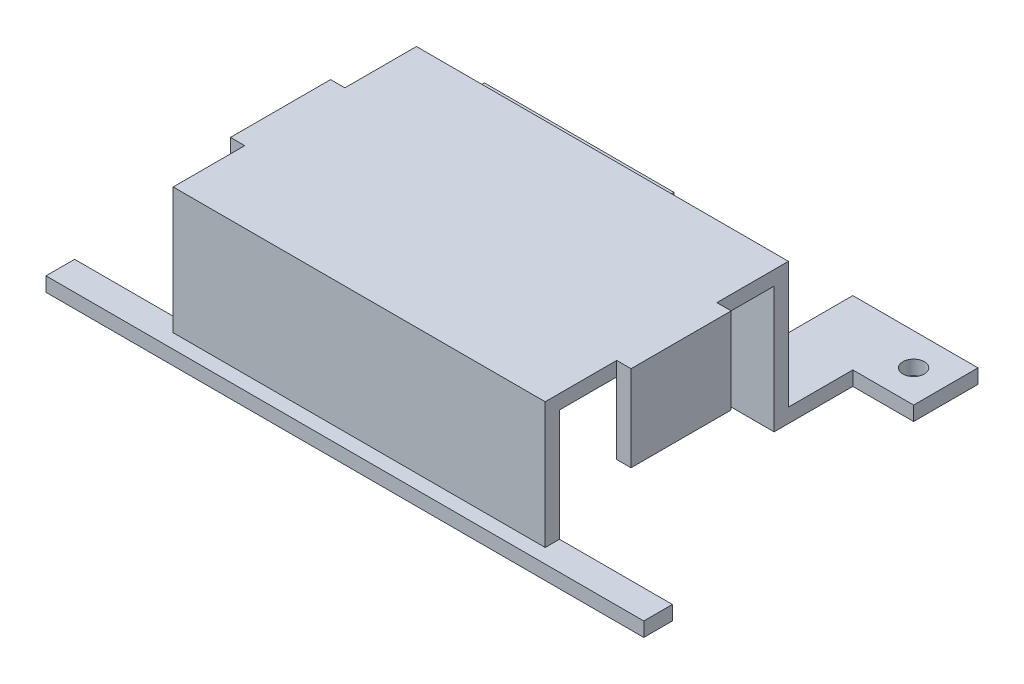
ISO-10303-21;
HEADER;
FILE_DESCRIPTION(('STEP AP214'),'2;1');
FILE_NAME('part.step','',(''),(''),'','','');
FILE_SCHEMA(('AUTOMOTIVE_DESIGN { 1 0 10303 214 1 1 1 1 }'));
ENDSEC;
DATA;
#1=APPLICATION_CONTEXT('core data for automotive mechanical design processes');
#2=APPLICATION_PROTOCOL_DEFINITION('international standard','automotive_design',2000,#1);
#3=PRODUCT_CONTEXT('',#1,'mechanical');
#4=PRODUCT('Part','Part','',(#3));
#5=PRODUCT_RELATED_PRODUCT_CATEGORY('part','',(#4));
#6=PRODUCT_DEFINITION_FORMATION('','',#4);
#7=PRODUCT_DEFINITION_CONTEXT('part definition',#1,'design');
#8=PRODUCT_DEFINITION('design','',#6,#7);
#9=PRODUCT_DEFINITION_SHAPE('','',#8);
#10=(LENGTH_UNIT() NAMED_UNIT(*) SI_UNIT(.MILLI.,.METRE.));
#11=(NAMED_UNIT(*) PLANE_ANGLE_UNIT() SI_UNIT($,.RADIAN.));
#12=(NAMED_UNIT(*) SI_UNIT($,.STERADIAN.) SOLID_ANGLE_UNIT());
#13=UNCERTAINTY_MEASURE_WITH_UNIT(LENGTH_MEASURE(1.E-05),#10,'distance_accuracy_value','');
#14=(GEOMETRIC_REPRESENTATION_CONTEXT(3) GLOBAL_UNCERTAINTY_ASSIGNED_CONTEXT((#13)) GLOBAL_UNIT_ASSIGNED_CONTEXT((#10,
#11,#12)) REPRESENTATION_CONTEXT('',''));
#15=CARTESIAN_POINT('',(0.,0.,0.));
#16=DIRECTION('',(0.,0.,1.));
#17=DIRECTION('',(1.,0.,0.));
#18=AXIS2_PLACEMENT_3D('',#15,#16,#17);
#19=CARTESIAN_POINT('',(0.,17.65,0.));
#20=DIRECTION('',(0.,1.,0.));
#21=DIRECTION('',(0.,0.,1.));
#22=AXIS2_PLACEMENT_3D('',#19,#20,#21);
#23=PLANE('',#22);
#24=DIRECTION('',(0.,0.,-1.));
#25=VECTOR('',#24,1.);
#26=CARTESIAN_POINT('',(52.,17.65,-24.));
#27=LINE('',#26,#25);
#28=CARTESIAN_POINT('',(52.,17.65,-10.));
#29=VERTEX_POINT('',#28);
#30=CARTESIAN_POINT('',(52.,17.65,-24.));
#31=VERTEX_POINT('',#30);
#32=EDGE_CURVE('E279',#29,#31,#27,.T.);
#33=ORIENTED_EDGE('',*,*,#32,.F.);
#34=DIRECTION('',(0.,0.,1.));
#35=VECTOR('',#34,1.);
#36=CARTESIAN_POINT('',(52.,17.65,-2.));
#37=LINE('',#36,#35);
#38=CARTESIAN_POINT('',(52.,17.65,-2.));
#39=VERTEX_POINT('',#38);
#40=EDGE_CURVE('E547',#29,#39,#37,.T.);
#41=ORIENTED_EDGE('',*,*,#40,.T.);
#42=DIRECTION('',(-1.,0.,0.));
#43=VECTOR('',#42,1.);
#44=CARTESIAN_POINT('',(52.,17.65,-2.));
#45=LINE('',#44,#43);
#46=CARTESIAN_POINT('',(0.,17.65,-2.));
#47=VERTEX_POINT('',#46);
#48=EDGE_CURVE('E546',#39,#47,#45,.T.);
#49=ORIENTED_EDGE('',*,*,#48,.T.);
#50=DIRECTION('',(0.,0.,-1.));
#51=VECTOR('',#50,1.);
#52=CARTESIAN_POINT('',(0.,17.65,-2.));
#53=LINE('',#52,#51);
#54=CARTESIAN_POINT('',(0.,17.65,-10.));
#55=VERTEX_POINT('',#54);
#56=EDGE_CURVE('E552',#47,#55,#53,.T.);
#57=ORIENTED_EDGE('',*,*,#56,.T.);
#58=DIRECTION('',(0.,0.,1.));
#59=VECTOR('',#58,1.);
#60=CARTESIAN_POINT('',(0.,17.65,-24.));
#61=LINE('',#60,#59);
#62=CARTESIAN_POINT('',(0.,17.65,-24.));
#63=VERTEX_POINT('',#62);
#64=EDGE_CURVE('E285',#63,#55,#61,.T.);
#65=ORIENTED_EDGE('',*,*,#64,.F.);
#66=CARTESIAN_POINT('',(0.,17.65,-34.));
#67=VERTEX_POINT('',#66);
#68=EDGE_CURVE('E551',#63,#67,#53,.T.);
#69=ORIENTED_EDGE('',*,*,#68,.T.);
#70=DIRECTION('',(-1.,0.,0.));
#71=VECTOR('',#70,1.);
#72=CARTESIAN_POINT('',(0.,17.65,-34.));
#73=LINE('',#72,#71);
#74=CARTESIAN_POINT('',(9.5,17.65,-34.));
#75=VERTEX_POINT('',#74);
#76=EDGE_CURVE('E398',#75,#67,#73,.T.);
#77=ORIENTED_EDGE('',*,*,#76,.F.);
#78=DIRECTION('',(0.,0.,-1.));
#79=VECTOR('',#78,1.);
#80=CARTESIAN_POINT('',(9.5,17.65,-43.));
#81=LINE('',#80,#79);
#82=CARTESIAN_POINT('',(9.5,17.65,-32.));
#83=VERTEX_POINT('',#82);
#84=EDGE_CURVE('E385',#83,#75,#81,.T.);
#85=ORIENTED_EDGE('',*,*,#84,.F.);
#86=DIRECTION('',(1.,0.,0.));
#87=VECTOR('',#86,1.);
#88=CARTESIAN_POINT('',(52.,17.65,-32.));
#89=LINE('',#88,#87);
#90=CARTESIAN_POINT('',(52.,17.65,-32.));
#91=VERTEX_POINT('',#90);
#92=EDGE_CURVE('E556',#83,#91,#89,.T.);
#93=ORIENTED_EDGE('',*,*,#92,.T.);
#94=EDGE_CURVE('E542',#91,#31,#37,.T.);
#95=ORIENTED_EDGE('',*,*,#94,.T.);
#96=EDGE_LOOP('',(#33,#41,#49,#57,#65,#69,#77,#85,#93,#95));
#97=FACE_BOUND('',#96,.T.);
#98=ADVANCED_FACE('F39',(#97),#23,.F.);
#99=CARTESIAN_POINT('',(52.,19.65,0.));
#100=DIRECTION('',(-1.,0.,0.));
#101=DIRECTION('',(0.,0.,1.));
#102=AXIS2_PLACEMENT_3D('',#99,#100,#101);
#103=PLANE('',#102);
#104=DIRECTION('',(0.,1.,0.));
#105=VECTOR('',#104,1.);
#106=CARTESIAN_POINT('',(52.,17.65,-24.));
#107=LINE('',#106,#105);
#108=CARTESIAN_POINT('',(52.,19.65,-24.));
#109=VERTEX_POINT('',#108);
#110=EDGE_CURVE('E316',#31,#109,#107,.T.);
#111=ORIENTED_EDGE('',*,*,#110,.F.);
#112=ORIENTED_EDGE('',*,*,#94,.F.);
#113=DIRECTION('',(0.,-1.,0.));
#114=VECTOR('',#113,1.);
#115=CARTESIAN_POINT('',(52.,17.65,-32.));
#116=LINE('',#115,#114);
#117=CARTESIAN_POINT('',(52.,0.,-32.));
#118=VERTEX_POINT('',#117);
#119=EDGE_CURVE('E565',#91,#118,#116,.T.);
#120=ORIENTED_EDGE('',*,*,#119,.T.);
#121=DIRECTION('',(0.,0.,-1.));
#122=VECTOR('',#121,1.);
#123=CARTESIAN_POINT('',(52.,0.,0.));
#124=LINE('',#123,#122);
#125=CARTESIAN_POINT('',(52.,0.,-43.));
#126=VERTEX_POINT('',#125);
#127=EDGE_CURVE('E569',#118,#126,#124,.T.);
#128=ORIENTED_EDGE('',*,*,#127,.T.);
#129=DIRECTION('',(0.,1.,0.));
#130=VECTOR('',#129,1.);
#131=CARTESIAN_POINT('',(52.,2.,-43.));
#132=LINE('',#131,#130);
#133=CARTESIAN_POINT('',(52.,2.,-43.));
#134=VERTEX_POINT('',#133);
#135=EDGE_CURVE('E361',#126,#134,#132,.T.);
#136=ORIENTED_EDGE('',*,*,#135,.T.);
#137=DIRECTION('',(0.,0.,1.));
#138=VECTOR('',#137,1.);
#139=CARTESIAN_POINT('',(52.,2.,-43.));
#140=LINE('',#139,#138);
#141=CARTESIAN_POINT('',(52.,2.,-34.));
#142=VERTEX_POINT('',#141);
#143=EDGE_CURVE('E365',#134,#142,#140,.T.);
#144=ORIENTED_EDGE('',*,*,#143,.T.);
#145=DIRECTION('',(0.,-1.,0.));
#146=VECTOR('',#145,1.);
#147=CARTESIAN_POINT('',(52.,19.65,-34.));
#148=LINE('',#147,#146);
#149=CARTESIAN_POINT('',(52.,19.65,-34.));
#150=VERTEX_POINT('',#149);
#151=EDGE_CURVE('E603',#150,#142,#148,.T.);
#152=ORIENTED_EDGE('',*,*,#151,.F.);
#153=DIRECTION('',(0.,0.,-1.));
#154=VECTOR('',#153,1.);
#155=CARTESIAN_POINT('',(52.,19.65,0.));
#156=LINE('',#155,#154);
#157=EDGE_CURVE('E585',#109,#150,#156,.T.);
#158=ORIENTED_EDGE('',*,*,#157,.F.);
#159=EDGE_LOOP('',(#111,#112,#120,#128,#136,#144,#152,#158));
#160=FACE_BOUND('',#159,.T.);
#161=ADVANCED_FACE('F669',(#160),#103,.F.);
#162=DIRECTION('',(0.,-1.,0.));
#163=VECTOR('',#162,1.);
#164=CARTESIAN_POINT('',(52.,17.65,-10.));
#165=LINE('',#164,#163);
#166=CARTESIAN_POINT('',(52.,19.65,-10.));
#167=VERTEX_POINT('',#166);
#168=EDGE_CURVE('E320',#167,#29,#165,.T.);
#169=ORIENTED_EDGE('',*,*,#168,.F.);
#170=CARTESIAN_POINT('',(52.,19.65,0.));
#171=VERTEX_POINT('',#170);
#172=EDGE_CURVE('E586',#171,#167,#156,.T.);
#173=ORIENTED_EDGE('',*,*,#172,.F.);
#174=DIRECTION('',(0.,-1.,0.));
#175=VECTOR('',#174,1.);
#176=CARTESIAN_POINT('',(52.,19.65,0.));
#177=LINE('',#176,#175);
#178=CARTESIAN_POINT('',(52.,2.,0.));
#179=VERTEX_POINT('',#178);
#180=EDGE_CURVE('E607',#171,#179,#177,.T.);
#181=ORIENTED_EDGE('',*,*,#180,.T.);
#182=DIRECTION('',(0.,0.,1.));
#183=VECTOR('',#182,1.);
#184=CARTESIAN_POINT('',(52.,2.,2.));
#185=LINE('',#184,#183);
#186=CARTESIAN_POINT('',(52.,2.,-2.));
#187=VERTEX_POINT('',#186);
#188=EDGE_CURVE('E402',#187,#179,#185,.T.);
#189=ORIENTED_EDGE('',*,*,#188,.F.);
#190=DIRECTION('',(0.,-1.,0.));
#191=VECTOR('',#190,1.);
#192=CARTESIAN_POINT('',(52.,17.65,-2.));
#193=LINE('',#192,#191);
#194=EDGE_CURVE('E559',#39,#187,#193,.T.);
#195=ORIENTED_EDGE('',*,*,#194,.F.);
#196=ORIENTED_EDGE('',*,*,#40,.F.);
#197=EDGE_LOOP('',(#169,#173,#181,#189,#195,#196));
#198=FACE_BOUND('',#197,.T.);
#199=ADVANCED_FACE('F692',(#198),#103,.F.);
#200=CARTESIAN_POINT('',(0.,19.65,0.));
#201=DIRECTION('',(1.,0.,0.));
#202=DIRECTION('',(0.,0.,-1.));
#203=AXIS2_PLACEMENT_3D('',#200,#201,#202);
#204=PLANE('',#203);
#205=DIRECTION('',(0.,-1.,0.));
#206=VECTOR('',#205,1.);
#207=CARTESIAN_POINT('',(0.,19.65,-24.));
#208=LINE('',#207,#206);
#209=CARTESIAN_POINT('',(0.,19.65,-24.));
#210=VERTEX_POINT('',#209);
#211=EDGE_CURVE('E337',#210,#63,#208,.T.);
#212=ORIENTED_EDGE('',*,*,#211,.F.);
#213=DIRECTION('',(0.,0.,1.));
#214=VECTOR('',#213,1.);
#215=CARTESIAN_POINT('',(0.,19.65,0.));
#216=LINE('',#215,#214);
#217=CARTESIAN_POINT('',(0.,19.65,-34.));
#218=VERTEX_POINT('',#217);
#219=EDGE_CURVE('E577',#218,#210,#216,.T.);
#220=ORIENTED_EDGE('',*,*,#219,.F.);
#221=DIRECTION('',(0.,-1.,0.));
#222=VECTOR('',#221,1.);
#223=CARTESIAN_POINT('',(0.,19.65,-34.));
#224=LINE('',#223,#222);
#225=EDGE_CURVE('E593',#218,#67,#224,.T.);
#226=ORIENTED_EDGE('',*,*,#225,.T.);
#227=ORIENTED_EDGE('',*,*,#68,.F.);
#228=EDGE_LOOP('',(#212,#220,#226,#227));
#229=FACE_BOUND('',#228,.T.);
#230=ADVANCED_FACE('F41',(#229),#204,.F.);
#231=DIRECTION('',(0.,1.,0.));
#232=VECTOR('',#231,1.);
#233=CARTESIAN_POINT('',(0.,19.65,-10.));
#234=LINE('',#233,#232);
#235=CARTESIAN_POINT('',(0.,19.65,-10.));
#236=VERTEX_POINT('',#235);
#237=EDGE_CURVE('E342',#55,#236,#234,.T.);
#238=ORIENTED_EDGE('',*,*,#237,.F.);
#239=ORIENTED_EDGE('',*,*,#56,.F.);
#240=DIRECTION('',(0.,-1.,0.));
#241=VECTOR('',#240,1.);
#242=CARTESIAN_POINT('',(0.,17.65,-2.));
#243=LINE('',#242,#241);
#244=CARTESIAN_POINT('',(0.,2.,-2.));
#245=VERTEX_POINT('',#244);
#246=EDGE_CURVE('E570',#47,#245,#243,.T.);
#247=ORIENTED_EDGE('',*,*,#246,.T.);
#248=DIRECTION('',(0.,0.,-1.));
#249=VECTOR('',#248,1.);
#250=CARTESIAN_POINT('',(0.,2.,2.));
#251=LINE('',#250,#249);
#252=CARTESIAN_POINT('',(0.,2.,0.));
#253=VERTEX_POINT('',#252);
#254=EDGE_CURVE('E423',#253,#245,#251,.T.);
#255=ORIENTED_EDGE('',*,*,#254,.F.);
#256=DIRECTION('',(0.,-1.,0.));
#257=VECTOR('',#256,1.);
#258=CARTESIAN_POINT('',(0.,19.65,0.));
#259=LINE('',#258,#257);
#260=CARTESIAN_POINT('',(0.,19.65,0.));
#261=VERTEX_POINT('',#260);
#262=EDGE_CURVE('E611',#261,#253,#259,.T.);
#263=ORIENTED_EDGE('',*,*,#262,.F.);
#264=EDGE_CURVE('E582',#236,#261,#216,.T.);
#265=ORIENTED_EDGE('',*,*,#264,.F.);
#266=EDGE_LOOP('',(#238,#239,#247,#255,#263,#265));
#267=FACE_BOUND('',#266,.T.);
#268=ADVANCED_FACE('F706',(#267),#204,.F.);
#269=CARTESIAN_POINT('',(52.,17.65,-32.));
#270=DIRECTION('',(0.,0.,-1.));
#271=DIRECTION('',(-1.,0.,0.));
#272=AXIS2_PLACEMENT_3D('',#269,#270,#271);
#273=PLANE('',#272);
#274=DIRECTION('',(0.,1.,0.));
#275=VECTOR('',#274,1.);
#276=CARTESIAN_POINT('',(9.5,17.65,-32.));
#277=LINE('',#276,#275);
#278=CARTESIAN_POINT('',(9.5,0.,-32.));
#279=VERTEX_POINT('',#278);
#280=EDGE_CURVE('E382',#279,#83,#277,.T.);
#281=ORIENTED_EDGE('',*,*,#280,.F.);
#282=DIRECTION('',(1.,0.,0.));
#283=VECTOR('',#282,1.);
#284=CARTESIAN_POINT('',(52.,0.,-32.));
#285=LINE('',#284,#283);
#286=EDGE_CURVE('E562',#279,#118,#285,.T.);
#287=ORIENTED_EDGE('',*,*,#286,.T.);
#288=ORIENTED_EDGE('',*,*,#119,.F.);
#289=ORIENTED_EDGE('',*,*,#92,.F.);
#290=EDGE_LOOP('',(#281,#287,#288,#289));
#291=FACE_BOUND('',#290,.T.);
#292=ADVANCED_FACE('F741',(#291),#273,.F.);
#293=CARTESIAN_POINT('',(0.,19.65,0.));
#294=DIRECTION('',(0.,0.,-1.));
#295=DIRECTION('',(-1.,0.,0.));
#296=AXIS2_PLACEMENT_3D('',#293,#294,#295);
#297=PLANE('',#296);
#298=DIRECTION('',(-1.,0.,0.));
#299=VECTOR('',#298,1.);
#300=CARTESIAN_POINT('',(0.,2.,0.));
#301=LINE('',#300,#299);
#302=EDGE_CURVE('E445',#179,#253,#301,.T.);
#303=ORIENTED_EDGE('',*,*,#302,.F.);
#304=ORIENTED_EDGE('',*,*,#180,.F.);
#305=DIRECTION('',(1.,0.,0.));
#306=VECTOR('',#305,1.);
#307=CARTESIAN_POINT('',(0.,19.65,0.));
#308=LINE('',#307,#306);
#309=EDGE_CURVE('E581',#261,#171,#308,.T.);
#310=ORIENTED_EDGE('',*,*,#309,.F.);
#311=ORIENTED_EDGE('',*,*,#262,.T.);
#312=EDGE_LOOP('',(#303,#304,#310,#311));
#313=FACE_BOUND('',#312,.T.);
#314=ADVANCED_FACE('F700',(#313),#297,.F.);
#315=CARTESIAN_POINT('',(0.,19.65,-34.));
#316=DIRECTION('',(0.,0.,1.));
#317=DIRECTION('',(1.,0.,0.));
#318=AXIS2_PLACEMENT_3D('',#315,#316,#317);
#319=PLANE('',#318);
#320=DIRECTION('',(0.,-1.,0.));
#321=VECTOR('',#320,1.);
#322=CARTESIAN_POINT('',(9.5,19.65,-34.));
#323=LINE('',#322,#321);
#324=CARTESIAN_POINT('',(9.5,2.,-34.));
#325=VERTEX_POINT('',#324);
#326=EDGE_CURVE('E395',#75,#325,#323,.T.);
#327=ORIENTED_EDGE('',*,*,#326,.F.);
#328=ORIENTED_EDGE('',*,*,#76,.T.);
#329=ORIENTED_EDGE('',*,*,#225,.F.);
#330=DIRECTION('',(-1.,0.,0.));
#331=VECTOR('',#330,1.);
#332=CARTESIAN_POINT('',(0.,19.65,-34.));
#333=LINE('',#332,#331);
#334=EDGE_CURVE('E590',#150,#218,#333,.T.);
#335=ORIENTED_EDGE('',*,*,#334,.F.);
#336=ORIENTED_EDGE('',*,*,#151,.T.);
#337=DIRECTION('',(1.,0.,0.));
#338=VECTOR('',#337,1.);
#339=CARTESIAN_POINT('',(52.,2.,-34.));
#340=LINE('',#339,#338);
#341=CARTESIAN_POINT('',(43.,2.,-34.));
#342=VERTEX_POINT('',#341);
#343=EDGE_CURVE('E521',#342,#142,#340,.T.);
#344=ORIENTED_EDGE('',*,*,#343,.F.);
#345=DIRECTION('',(0.,1.,0.));
#346=VECTOR('',#345,1.);
#347=CARTESIAN_POINT('',(43.,0.,-34.));
#348=LINE('',#347,#346);
#349=CARTESIAN_POINT('',(43.,0.,-34.));
#350=VERTEX_POINT('',#349);
#351=EDGE_CURVE('E516',#350,#342,#348,.T.);
#352=ORIENTED_EDGE('',*,*,#351,.F.);
#353=DIRECTION('',(-1.,0.,0.));
#354=VECTOR('',#353,1.);
#355=CARTESIAN_POINT('',(0.,0.,-34.));
#356=LINE('',#355,#354);
#357=CARTESIAN_POINT('',(18.,0.,-34.));
#358=VERTEX_POINT('',#357);
#359=EDGE_CURVE('E596',#350,#358,#356,.T.);
#360=ORIENTED_EDGE('',*,*,#359,.T.);
#361=DIRECTION('',(0.,-1.,0.));
#362=VECTOR('',#361,1.);
#363=CARTESIAN_POINT('',(18.,0.,-34.));
#364=LINE('',#363,#362);
#365=CARTESIAN_POINT('',(18.,2.,-34.));
#366=VERTEX_POINT('',#365);
#367=EDGE_CURVE('E498',#366,#358,#364,.T.);
#368=ORIENTED_EDGE('',*,*,#367,.F.);
#369=DIRECTION('',(1.,0.,0.));
#370=VECTOR('',#369,1.);
#371=CARTESIAN_POINT('',(0.,2.,-34.));
#372=LINE('',#371,#370);
#373=EDGE_CURVE('E493',#325,#366,#372,.T.);
#374=ORIENTED_EDGE('',*,*,#373,.F.);
#375=EDGE_LOOP('',(#327,#328,#329,#335,#336,#344,#352,#360,#368,#374));
#376=FACE_BOUND('',#375,.T.);
#377=ADVANCED_FACE('F643',(#376),#319,.F.);
#378=CARTESIAN_POINT('',(0.,0.,0.));
#379=DIRECTION('',(0.,-1.,0.));
#380=DIRECTION('',(0.,0.,-1.));
#381=AXIS2_PLACEMENT_3D('',#378,#379,#380);
#382=PLANE('',#381);
#383=DIRECTION('',(1.,0.,0.));
#384=VECTOR('',#383,1.);
#385=CARTESIAN_POINT('',(52.,0.,-43.));
#386=LINE('',#385,#384);
#387=CARTESIAN_POINT('',(60.5,0.,-43.));
#388=VERTEX_POINT('',#387);
#389=EDGE_CURVE('E55',#126,#388,#386,.T.);
#390=ORIENTED_EDGE('',*,*,#389,.F.);
#391=ORIENTED_EDGE('',*,*,#127,.F.);
#392=ORIENTED_EDGE('',*,*,#286,.F.);
#393=DIRECTION('',(0.,0.,1.));
#394=VECTOR('',#393,1.);
#395=CARTESIAN_POINT('',(9.5,0.,-43.));
#396=LINE('',#395,#394);
#397=CARTESIAN_POINT('',(9.5,0.,-43.));
#398=VERTEX_POINT('',#397);
#399=EDGE_CURVE('E379',#398,#279,#396,.T.);
#400=ORIENTED_EDGE('',*,*,#399,.F.);
#401=DIRECTION('',(-1.,0.,0.));
#402=VECTOR('',#401,1.);
#403=CARTESIAN_POINT('',(9.5,0.,-43.));
#404=LINE('',#403,#402);
#405=CARTESIAN_POINT('',(-8.5,0.,-43.));
#406=VERTEX_POINT('',#405);
#407=EDGE_CURVE('E389',#398,#406,#404,.T.);
#408=ORIENTED_EDGE('',*,*,#407,.T.);
#409=DIRECTION('',(0.,0.,1.));
#410=VECTOR('',#409,1.);
#411=CARTESIAN_POINT('',(-8.5,0.,-34.));
#412=LINE('',#411,#410);
#413=CARTESIAN_POINT('',(-8.5,0.,-52.));
#414=VERTEX_POINT('',#413);
#415=EDGE_CURVE('E478',#414,#406,#412,.T.);
#416=ORIENTED_EDGE('',*,*,#415,.F.);
#417=DIRECTION('',(-1.,0.,0.));
#418=VECTOR('',#417,1.);
#419=CARTESIAN_POINT('',(0.,0.,-52.));
#420=LINE('',#419,#418);
#421=CARTESIAN_POINT('',(18.,0.,-52.));
#422=VERTEX_POINT('',#421);
#423=EDGE_CURVE('E501',#422,#414,#420,.T.);
#424=ORIENTED_EDGE('',*,*,#423,.F.);
#425=DIRECTION('',(0.,0.,1.));
#426=VECTOR('',#425,1.);
#427=CARTESIAN_POINT('',(18.,0.,-52.));
#428=LINE('',#427,#426);
#429=EDGE_CURVE('E504',#422,#358,#428,.T.);
#430=ORIENTED_EDGE('',*,*,#429,.T.);
#431=ORIENTED_EDGE('',*,*,#359,.F.);
#432=DIRECTION('',(0.,0.,1.));
#433=VECTOR('',#432,1.);
#434=CARTESIAN_POINT('',(43.,0.,-52.));
#435=LINE('',#434,#433);
#436=CARTESIAN_POINT('',(43.,0.,-52.));
#437=VERTEX_POINT('',#436);
#438=EDGE_CURVE('E537',#437,#350,#435,.T.);
#439=ORIENTED_EDGE('',*,*,#438,.F.);
#440=DIRECTION('',(-1.,0.,0.));
#441=VECTOR('',#440,1.);
#442=CARTESIAN_POINT('',(52.,0.,-52.));
#443=LINE('',#442,#441);
#444=CARTESIAN_POINT('',(60.5,0.,-52.));
#445=VERTEX_POINT('',#444);
#446=EDGE_CURVE('E517',#445,#437,#443,.T.);
#447=ORIENTED_EDGE('',*,*,#446,.F.);
#448=DIRECTION('',(0.,0.,-1.));
#449=VECTOR('',#448,1.);
#450=CARTESIAN_POINT('',(60.5,0.,-34.));
#451=LINE('',#450,#449);
#452=EDGE_CURVE('E482',#388,#445,#451,.T.);
#453=ORIENTED_EDGE('',*,*,#452,.F.);
#454=EDGE_LOOP('',(#390,#391,#392,#400,#408,#416,#424,#430,#431,#439,#447,#453));
#455=FACE_BOUND('',#454,.T.);
#456=CARTESIAN_POINT('',(56.,0.,-47.5));
#457=DIRECTION('',(0.,1.,0.));
#458=DIRECTION('',(0.,0.,1.));
#459=AXIS2_PLACEMENT_3D('',#456,#457,#458);
#460=CIRCLE('',#459,1.5);
#461=CARTESIAN_POINT('',(56.,0.,-46.));
#462=VERTEX_POINT('',#461);
#463=EDGE_CURVE('E456',#462,#462,#460,.T.);
#464=ORIENTED_EDGE('',*,*,#463,.T.);
#465=EDGE_LOOP('',(#464));
#466=FACE_BOUND('',#465,.T.);
#467=CARTESIAN_POINT('',(-4.,0.,-47.5));
#468=DIRECTION('',(0.,1.,0.));
#469=DIRECTION('',(0.,0.,1.));
#470=AXIS2_PLACEMENT_3D('',#467,#468,#469);
#471=CIRCLE('',#470,1.5);
#472=CARTESIAN_POINT('',(-4.,0.,-46.));
#473=VERTEX_POINT('',#472);
#474=EDGE_CURVE('E465',#473,#473,#471,.T.);
#475=ORIENTED_EDGE('',*,*,#474,.T.);
#476=EDGE_LOOP('',(#475));
#477=FACE_BOUND('',#476,.T.);
#478=ADVANCED_FACE('F631',(#455,#466,#477),#382,.T.);
#479=CARTESIAN_POINT('',(0.,19.65,0.));
#480=DIRECTION('',(0.,-1.,0.));
#481=DIRECTION('',(0.,0.,-1.));
#482=AXIS2_PLACEMENT_3D('',#479,#480,#481);
#483=PLANE('',#482);
#484=ORIENTED_EDGE('',*,*,#219,.T.);
#485=DIRECTION('',(1.,0.,0.));
#486=VECTOR('',#485,1.);
#487=CARTESIAN_POINT('',(-2.,19.65,-24.));
#488=LINE('',#487,#486);
#489=CARTESIAN_POINT('',(-2.,19.65,-24.));
#490=VERTEX_POINT('',#489);
#491=EDGE_CURVE('E348',#490,#210,#488,.T.);
#492=ORIENTED_EDGE('',*,*,#491,.F.);
#493=DIRECTION('',(0.,0.,-1.));
#494=VECTOR('',#493,1.);
#495=CARTESIAN_POINT('',(-2.,19.65,-24.));
#496=LINE('',#495,#494);
#497=CARTESIAN_POINT('',(-2.,19.65,-10.));
#498=VERTEX_POINT('',#497);
#499=EDGE_CURVE('E345',#498,#490,#496,.T.);
#500=ORIENTED_EDGE('',*,*,#499,.F.);
#501=DIRECTION('',(1.,0.,0.));
#502=VECTOR('',#501,1.);
#503=CARTESIAN_POINT('',(-2.,19.65,-10.));
#504=LINE('',#503,#502);
#505=EDGE_CURVE('E356',#498,#236,#504,.T.);
#506=ORIENTED_EDGE('',*,*,#505,.T.);
#507=ORIENTED_EDGE('',*,*,#264,.T.);
#508=ORIENTED_EDGE('',*,*,#309,.T.);
#509=ORIENTED_EDGE('',*,*,#172,.T.);
#510=DIRECTION('',(-1.,0.,0.));
#511=VECTOR('',#510,1.);
#512=CARTESIAN_POINT('',(54.,19.65,-10.));
#513=LINE('',#512,#511);
#514=CARTESIAN_POINT('',(54.,19.65,-10.));
#515=VERTEX_POINT('',#514);
#516=EDGE_CURVE('E326',#515,#167,#513,.T.);
#517=ORIENTED_EDGE('',*,*,#516,.F.);
#518=DIRECTION('',(0.,0.,1.));
#519=VECTOR('',#518,1.);
#520=CARTESIAN_POINT('',(54.,19.65,-24.));
#521=LINE('',#520,#519);
#522=CARTESIAN_POINT('',(54.,19.65,-24.));
#523=VERTEX_POINT('',#522);
#524=EDGE_CURVE('E319',#523,#515,#521,.T.);
#525=ORIENTED_EDGE('',*,*,#524,.F.);
#526=DIRECTION('',(-1.,0.,0.));
#527=VECTOR('',#526,1.);
#528=CARTESIAN_POINT('',(54.,19.65,-24.));
#529=LINE('',#528,#527);
#530=EDGE_CURVE('E334',#523,#109,#529,.T.);
#531=ORIENTED_EDGE('',*,*,#530,.T.);
#532=ORIENTED_EDGE('',*,*,#157,.T.);
#533=ORIENTED_EDGE('',*,*,#334,.T.);
#534=EDGE_LOOP('',(#484,#492,#500,#506,#507,#508,#509,#517,#525,#531,#532,#533));
#535=FACE_BOUND('',#534,.T.);
#536=ADVANCED_FACE('F675',(#535),#483,.F.);
#537=DIRECTION('',(-1.,0.,0.));
#538=VECTOR('',#537,1.);
#539=CARTESIAN_POINT('',(52.,0.,-2.));
#540=LINE('',#539,#538);
#541=CARTESIAN_POINT('',(67.78,0.,-2.));
#542=VERTEX_POINT('',#541);
#543=CARTESIAN_POINT('',(-15.78,0.,-2.));
#544=VERTEX_POINT('',#543);
#545=EDGE_CURVE('E541',#542,#544,#540,.T.);
#546=ORIENTED_EDGE('',*,*,#545,.F.);
#547=DIRECTION('',(0.,0.,-1.));
#548=VECTOR('',#547,1.);
#549=CARTESIAN_POINT('',(67.78,0.,2.));
#550=LINE('',#549,#548);
#551=CARTESIAN_POINT('',(67.78,0.,2.));
#552=VERTEX_POINT('',#551);
#553=EDGE_CURVE('E407',#552,#542,#550,.T.);
#554=ORIENTED_EDGE('',*,*,#553,.F.);
#555=DIRECTION('',(1.,0.,0.));
#556=VECTOR('',#555,1.);
#557=CARTESIAN_POINT('',(0.,0.,2.));
#558=LINE('',#557,#556);
#559=CARTESIAN_POINT('',(-15.78,0.,2.));
#560=VERTEX_POINT('',#559);
#561=EDGE_CURVE('E446',#560,#552,#558,.T.);
#562=ORIENTED_EDGE('',*,*,#561,.F.);
#563=DIRECTION('',(0.,0.,1.));
#564=VECTOR('',#563,1.);
#565=CARTESIAN_POINT('',(-15.78,0.,2.));
#566=LINE('',#565,#564);
#567=EDGE_CURVE('E435',#544,#560,#566,.T.);
#568=ORIENTED_EDGE('',*,*,#567,.F.);
#569=EDGE_LOOP('',(#546,#554,#562,#568));
#570=FACE_BOUND('',#569,.T.);
#571=ADVANCED_FACE('F716',(#570),#382,.T.);
#572=CARTESIAN_POINT('',(52.,17.65,-2.));
#573=DIRECTION('',(0.,0.,1.));
#574=DIRECTION('',(1.,0.,0.));
#575=AXIS2_PLACEMENT_3D('',#572,#573,#574);
#576=PLANE('',#575);
#577=ORIENTED_EDGE('',*,*,#545,.T.);
#578=DIRECTION('',(0.,-1.,0.));
#579=VECTOR('',#578,1.);
#580=CARTESIAN_POINT('',(-15.78,2.,-2.));
#581=LINE('',#580,#579);
#582=CARTESIAN_POINT('',(-15.78,2.,-2.));
#583=VERTEX_POINT('',#582);
#584=EDGE_CURVE('E431',#583,#544,#581,.T.);
#585=ORIENTED_EDGE('',*,*,#584,.F.);
#586=DIRECTION('',(1.,0.,0.));
#587=VECTOR('',#586,1.);
#588=CARTESIAN_POINT('',(-15.78,2.,-2.));
#589=LINE('',#588,#587);
#590=EDGE_CURVE('E439',#583,#245,#589,.T.);
#591=ORIENTED_EDGE('',*,*,#590,.T.);
#592=ORIENTED_EDGE('',*,*,#246,.F.);
#593=ORIENTED_EDGE('',*,*,#48,.F.);
#594=ORIENTED_EDGE('',*,*,#194,.T.);
#595=DIRECTION('',(-1.,0.,0.));
#596=VECTOR('',#595,1.);
#597=CARTESIAN_POINT('',(67.78,2.,-2.));
#598=LINE('',#597,#596);
#599=CARTESIAN_POINT('',(67.78,2.,-2.));
#600=VERTEX_POINT('',#599);
#601=EDGE_CURVE('E418',#600,#187,#598,.T.);
#602=ORIENTED_EDGE('',*,*,#601,.F.);
#603=DIRECTION('',(0.,1.,0.));
#604=VECTOR('',#603,1.);
#605=CARTESIAN_POINT('',(67.78,2.,-2.));
#606=LINE('',#605,#604);
#607=EDGE_CURVE('E411',#542,#600,#606,.T.);
#608=ORIENTED_EDGE('',*,*,#607,.F.);
#609=EDGE_LOOP('',(#577,#585,#591,#592,#593,#594,#602,#608));
#610=FACE_BOUND('',#609,.T.);
#611=ADVANCED_FACE('F689',(#610),#576,.F.);
#612=CARTESIAN_POINT('',(43.,0.,-52.));
#613=DIRECTION('',(1.,0.,0.));
#614=DIRECTION('',(0.,0.,-1.));
#615=AXIS2_PLACEMENT_3D('',#612,#613,#614);
#616=PLANE('',#615);
#617=ORIENTED_EDGE('',*,*,#351,.T.);
#618=DIRECTION('',(0.,0.,1.));
#619=VECTOR('',#618,1.);
#620=CARTESIAN_POINT('',(43.,2.,-52.));
#621=LINE('',#620,#619);
#622=CARTESIAN_POINT('',(43.,2.,-52.));
#623=VERTEX_POINT('',#622);
#624=EDGE_CURVE('E527',#623,#342,#621,.T.);
#625=ORIENTED_EDGE('',*,*,#624,.F.);
#626=DIRECTION('',(0.,1.,0.));
#627=VECTOR('',#626,1.);
#628=CARTESIAN_POINT('',(43.,0.,-52.));
#629=LINE('',#628,#627);
#630=EDGE_CURVE('E520',#437,#623,#629,.T.);
#631=ORIENTED_EDGE('',*,*,#630,.F.);
#632=ORIENTED_EDGE('',*,*,#438,.T.);
#633=EDGE_LOOP('',(#617,#625,#631,#632));
#634=FACE_BOUND('',#633,.T.);
#635=ADVANCED_FACE('F652',(#634),#616,.F.);
#636=CARTESIAN_POINT('',(52.,2.,-52.));
#637=DIRECTION('',(0.,-1.,0.));
#638=DIRECTION('',(0.,0.,-1.));
#639=AXIS2_PLACEMENT_3D('',#636,#637,#638);
#640=PLANE('',#639);
#641=CARTESIAN_POINT('',(56.,2.,-47.5));
#642=DIRECTION('',(0.,1.,0.));
#643=DIRECTION('',(0.,0.,1.));
#644=AXIS2_PLACEMENT_3D('',#641,#642,#643);
#645=CIRCLE('',#644,1.5);
#646=CARTESIAN_POINT('',(56.,2.,-46.));
#647=VERTEX_POINT('',#646);
#648=EDGE_CURVE('E461',#647,#647,#645,.T.);
#649=ORIENTED_EDGE('',*,*,#648,.F.);
#650=EDGE_LOOP('',(#649));
#651=FACE_BOUND('',#650,.T.);
#652=ORIENTED_EDGE('',*,*,#143,.F.);
#653=DIRECTION('',(1.,0.,0.));
#654=VECTOR('',#653,1.);
#655=CARTESIAN_POINT('',(52.,2.,-43.));
#656=LINE('',#655,#654);
#657=CARTESIAN_POINT('',(60.5,2.,-43.));
#658=VERTEX_POINT('',#657);
#659=EDGE_CURVE('E368',#134,#658,#656,.T.);
#660=ORIENTED_EDGE('',*,*,#659,.T.);
#661=DIRECTION('',(0.,0.,1.));
#662=VECTOR('',#661,1.);
#663=CARTESIAN_POINT('',(60.5,2.,-34.));
#664=LINE('',#663,#662);
#665=CARTESIAN_POINT('',(60.5,2.,-52.));
#666=VERTEX_POINT('',#665);
#667=EDGE_CURVE('E489',#666,#658,#664,.T.);
#668=ORIENTED_EDGE('',*,*,#667,.F.);
#669=DIRECTION('',(1.,0.,0.));
#670=VECTOR('',#669,1.);
#671=CARTESIAN_POINT('',(52.,2.,-52.));
#672=LINE('',#671,#670);
#673=EDGE_CURVE('E524',#623,#666,#672,.T.);
#674=ORIENTED_EDGE('',*,*,#673,.F.);
#675=ORIENTED_EDGE('',*,*,#624,.T.);
#676=ORIENTED_EDGE('',*,*,#343,.T.);
#677=EDGE_LOOP('',(#652,#660,#668,#674,#675,#676));
#678=FACE_BOUND('',#677,.T.);
#679=ADVANCED_FACE('F666',(#651,#678),#640,.F.);
#680=CARTESIAN_POINT('',(0.,0.,-52.));
#681=DIRECTION('',(0.,0.,1.));
#682=DIRECTION('',(1.,0.,0.));
#683=AXIS2_PLACEMENT_3D('',#680,#681,#682);
#684=PLANE('',#683);
#685=ORIENTED_EDGE('',*,*,#673,.T.);
#686=DIRECTION('',(0.,1.,0.));
#687=VECTOR('',#686,1.);
#688=CARTESIAN_POINT('',(60.5,2.,-52.));
#689=LINE('',#688,#687);
#690=EDGE_CURVE('E485',#445,#666,#689,.T.);
#691=ORIENTED_EDGE('',*,*,#690,.F.);
#692=ORIENTED_EDGE('',*,*,#446,.T.);
#693=ORIENTED_EDGE('',*,*,#630,.T.);
#694=EDGE_LOOP('',(#685,#691,#692,#693));
#695=FACE_BOUND('',#694,.T.);
#696=ADVANCED_FACE('F656',(#695),#684,.F.);
#697=CARTESIAN_POINT('',(0.,2.,-52.));
#698=DIRECTION('',(0.,-1.,0.));
#699=DIRECTION('',(1.,0.,0.));
#700=AXIS2_PLACEMENT_3D('',#697,#698,#699);
#701=PLANE('',#700);
#702=CARTESIAN_POINT('',(-4.,2.,-47.5));
#703=DIRECTION('',(0.,1.,0.));
#704=DIRECTION('',(0.,0.,1.));
#705=AXIS2_PLACEMENT_3D('',#702,#703,#704);
#706=CIRCLE('',#705,1.5);
#707=CARTESIAN_POINT('',(-4.,2.,-46.));
#708=VERTEX_POINT('',#707);
#709=EDGE_CURVE('E452',#708,#708,#706,.T.);
#710=ORIENTED_EDGE('',*,*,#709,.F.);
#711=EDGE_LOOP('',(#710));
#712=FACE_BOUND('',#711,.T.);
#713=DIRECTION('',(0.,0.,-1.));
#714=VECTOR('',#713,1.);
#715=CARTESIAN_POINT('',(-8.5,2.,-34.));
#716=LINE('',#715,#714);
#717=CARTESIAN_POINT('',(-8.5,2.,-43.));
#718=VERTEX_POINT('',#717);
#719=CARTESIAN_POINT('',(-8.5,2.,-52.));
#720=VERTEX_POINT('',#719);
#721=EDGE_CURVE('E460',#718,#720,#716,.T.);
#722=ORIENTED_EDGE('',*,*,#721,.F.);
#723=DIRECTION('',(1.,0.,0.));
#724=VECTOR('',#723,1.);
#725=CARTESIAN_POINT('',(0.,2.,-43.));
#726=LINE('',#725,#724);
#727=CARTESIAN_POINT('',(9.5,2.,-43.));
#728=VERTEX_POINT('',#727);
#729=EDGE_CURVE('E63',#718,#728,#726,.T.);
#730=ORIENTED_EDGE('',*,*,#729,.T.);
#731=DIRECTION('',(0.,0.,-1.));
#732=VECTOR('',#731,1.);
#733=CARTESIAN_POINT('',(9.5,2.,-52.));
#734=LINE('',#733,#732);
#735=EDGE_CURVE('E11',#325,#728,#734,.T.);
#736=ORIENTED_EDGE('',*,*,#735,.F.);
#737=ORIENTED_EDGE('',*,*,#373,.T.);
#738=DIRECTION('',(0.,0.,1.));
#739=VECTOR('',#738,1.);
#740=CARTESIAN_POINT('',(18.,2.,-52.));
#741=LINE('',#740,#739);
#742=CARTESIAN_POINT('',(18.,2.,-52.));
#743=VERTEX_POINT('',#742);
#744=EDGE_CURVE('E512',#743,#366,#741,.T.);
#745=ORIENTED_EDGE('',*,*,#744,.F.);
#746=DIRECTION('',(1.,0.,0.));
#747=VECTOR('',#746,1.);
#748=CARTESIAN_POINT('',(0.,2.,-52.));
#749=LINE('',#748,#747);
#750=EDGE_CURVE('E494',#720,#743,#749,.T.);
#751=ORIENTED_EDGE('',*,*,#750,.F.);
#752=EDGE_LOOP('',(#722,#730,#736,#737,#745,#751));
#753=FACE_BOUND('',#752,.T.);
#754=ADVANCED_FACE('F622',(#712,#753),#701,.F.);
#755=CARTESIAN_POINT('',(18.,0.,-52.));
#756=DIRECTION('',(-1.,0.,0.));
#757=DIRECTION('',(0.,0.,1.));
#758=AXIS2_PLACEMENT_3D('',#755,#756,#757);
#759=PLANE('',#758);
#760=ORIENTED_EDGE('',*,*,#367,.T.);
#761=ORIENTED_EDGE('',*,*,#429,.F.);
#762=DIRECTION('',(0.,-1.,0.));
#763=VECTOR('',#762,1.);
#764=CARTESIAN_POINT('',(18.,0.,-52.));
#765=LINE('',#764,#763);
#766=EDGE_CURVE('E497',#743,#422,#765,.T.);
#767=ORIENTED_EDGE('',*,*,#766,.F.);
#768=ORIENTED_EDGE('',*,*,#744,.T.);
#769=EDGE_LOOP('',(#760,#761,#767,#768));
#770=FACE_BOUND('',#769,.T.);
#771=ADVANCED_FACE('F647',(#770),#759,.F.);
#772=CARTESIAN_POINT('',(0.,0.,-52.));
#773=DIRECTION('',(0.,0.,-1.));
#774=DIRECTION('',(-1.,0.,0.));
#775=AXIS2_PLACEMENT_3D('',#772,#773,#774);
#776=PLANE('',#775);
#777=ORIENTED_EDGE('',*,*,#423,.T.);
#778=DIRECTION('',(0.,-1.,0.));
#779=VECTOR('',#778,1.);
#780=CARTESIAN_POINT('',(-8.5,2.,-52.));
#781=LINE('',#780,#779);
#782=EDGE_CURVE('E474',#720,#414,#781,.T.);
#783=ORIENTED_EDGE('',*,*,#782,.F.);
#784=ORIENTED_EDGE('',*,*,#750,.T.);
#785=ORIENTED_EDGE('',*,*,#766,.T.);
#786=EDGE_LOOP('',(#777,#783,#784,#785));
#787=FACE_BOUND('',#786,.T.);
#788=ADVANCED_FACE('F628',(#787),#776,.T.);
#789=CARTESIAN_POINT('',(60.5,0.,0.));
#790=DIRECTION('',(1.,0.,0.));
#791=DIRECTION('',(0.,0.,-1.));
#792=AXIS2_PLACEMENT_3D('',#789,#790,#791);
#793=PLANE('',#792);
#794=DIRECTION('',(0.,1.,0.));
#795=VECTOR('',#794,1.);
#796=CARTESIAN_POINT('',(60.5,2.,-43.));
#797=LINE('',#796,#795);
#798=EDGE_CURVE('E360',#388,#658,#797,.T.);
#799=ORIENTED_EDGE('',*,*,#798,.F.);
#800=ORIENTED_EDGE('',*,*,#452,.T.);
#801=ORIENTED_EDGE('',*,*,#690,.T.);
#802=ORIENTED_EDGE('',*,*,#667,.T.);
#803=EDGE_LOOP('',(#799,#800,#801,#802));
#804=FACE_BOUND('',#803,.T.);
#805=ADVANCED_FACE('F661',(#804),#793,.T.);
#806=CARTESIAN_POINT('',(-8.5,0.,0.));
#807=DIRECTION('',(1.,0.,0.));
#808=DIRECTION('',(0.,0.,-1.));
#809=AXIS2_PLACEMENT_3D('',#806,#807,#808);
#810=PLANE('',#809);
#811=ORIENTED_EDGE('',*,*,#415,.T.);
#812=DIRECTION('',(0.,1.,0.));
#813=VECTOR('',#812,1.);
#814=CARTESIAN_POINT('',(-8.5,0.,-43.));
#815=LINE('',#814,#813);
#816=EDGE_CURVE('E48',#406,#718,#815,.T.);
#817=ORIENTED_EDGE('',*,*,#816,.T.);
#818=ORIENTED_EDGE('',*,*,#721,.T.);
#819=ORIENTED_EDGE('',*,*,#782,.T.);
#820=EDGE_LOOP('',(#811,#817,#818,#819));
#821=FACE_BOUND('',#820,.T.);
#822=ADVANCED_FACE('F617',(#821),#810,.F.);
#823=CARTESIAN_POINT('',(-4.,0.,-47.5));
#824=DIRECTION('',(0.,1.,0.));
#825=DIRECTION('',(0.,0.,1.));
#826=AXIS2_PLACEMENT_3D('',#823,#824,#825);
#827=CYLINDRICAL_SURFACE('',#826,1.5);
#828=ORIENTED_EDGE('',*,*,#474,.F.);
#829=EDGE_LOOP('',(#828));
#830=FACE_BOUND('',#829,.T.);
#831=ORIENTED_EDGE('',*,*,#709,.T.);
#832=EDGE_LOOP('',(#831));
#833=FACE_BOUND('',#832,.T.);
#834=ADVANCED_FACE('F832',(#830,#833),#827,.F.);
#835=CARTESIAN_POINT('',(56.,0.,-47.5));
#836=DIRECTION('',(0.,1.,0.));
#837=DIRECTION('',(0.,0.,1.));
#838=AXIS2_PLACEMENT_3D('',#835,#836,#837);
#839=CYLINDRICAL_SURFACE('',#838,1.5);
#840=ORIENTED_EDGE('',*,*,#463,.F.);
#841=EDGE_LOOP('',(#840));
#842=FACE_BOUND('',#841,.T.);
#843=ORIENTED_EDGE('',*,*,#648,.T.);
#844=EDGE_LOOP('',(#843));
#845=FACE_BOUND('',#844,.T.);
#846=ADVANCED_FACE('F839',(#842,#845),#839,.F.);
#847=CARTESIAN_POINT('',(0.,2.,2.));
#848=DIRECTION('',(0.,-1.,0.));
#849=DIRECTION('',(0.,0.,-1.));
#850=AXIS2_PLACEMENT_3D('',#847,#848,#849);
#851=PLANE('',#850);
#852=ORIENTED_EDGE('',*,*,#302,.T.);
#853=ORIENTED_EDGE('',*,*,#254,.T.);
#854=ORIENTED_EDGE('',*,*,#590,.F.);
#855=DIRECTION('',(0.,0.,-1.));
#856=VECTOR('',#855,1.);
#857=CARTESIAN_POINT('',(-15.78,2.,2.));
#858=LINE('',#857,#856);
#859=CARTESIAN_POINT('',(-15.78,2.,2.));
#860=VERTEX_POINT('',#859);
#861=EDGE_CURVE('E428',#860,#583,#858,.T.);
#862=ORIENTED_EDGE('',*,*,#861,.F.);
#863=DIRECTION('',(-1.,0.,0.));
#864=VECTOR('',#863,1.);
#865=CARTESIAN_POINT('',(0.,2.,2.));
#866=LINE('',#865,#864);
#867=CARTESIAN_POINT('',(67.78,2.,2.));
#868=VERTEX_POINT('',#867);
#869=EDGE_CURVE('E449',#868,#860,#866,.T.);
#870=ORIENTED_EDGE('',*,*,#869,.F.);
#871=DIRECTION('',(0.,0.,1.));
#872=VECTOR('',#871,1.);
#873=CARTESIAN_POINT('',(67.78,2.,2.));
#874=LINE('',#873,#872);
#875=EDGE_CURVE('E414',#600,#868,#874,.T.);
#876=ORIENTED_EDGE('',*,*,#875,.F.);
#877=ORIENTED_EDGE('',*,*,#601,.T.);
#878=ORIENTED_EDGE('',*,*,#188,.T.);
#879=EDGE_LOOP('',(#852,#853,#854,#862,#870,#876,#877,#878));
#880=FACE_BOUND('',#879,.T.);
#881=ADVANCED_FACE('F697',(#880),#851,.F.);
#882=CARTESIAN_POINT('',(0.,0.,2.));
#883=DIRECTION('',(0.,0.,1.));
#884=DIRECTION('',(1.,0.,0.));
#885=AXIS2_PLACEMENT_3D('',#882,#883,#884);
#886=PLANE('',#885);
#887=ORIENTED_EDGE('',*,*,#869,.T.);
#888=DIRECTION('',(0.,1.,0.));
#889=VECTOR('',#888,1.);
#890=CARTESIAN_POINT('',(-15.78,2.,2.));
#891=LINE('',#890,#889);
#892=EDGE_CURVE('E424',#560,#860,#891,.T.);
#893=ORIENTED_EDGE('',*,*,#892,.F.);
#894=ORIENTED_EDGE('',*,*,#561,.T.);
#895=DIRECTION('',(0.,-1.,0.));
#896=VECTOR('',#895,1.);
#897=CARTESIAN_POINT('',(67.78,2.,2.));
#898=LINE('',#897,#896);
#899=EDGE_CURVE('E403',#868,#552,#898,.T.);
#900=ORIENTED_EDGE('',*,*,#899,.F.);
#901=EDGE_LOOP('',(#887,#893,#894,#900));
#902=FACE_BOUND('',#901,.T.);
#903=ADVANCED_FACE('F720',(#902),#886,.T.);
#904=CARTESIAN_POINT('',(-15.78,0.,0.));
#905=DIRECTION('',(1.,0.,0.));
#906=DIRECTION('',(0.,0.,-1.));
#907=AXIS2_PLACEMENT_3D('',#904,#905,#906);
#908=PLANE('',#907);
#909=ORIENTED_EDGE('',*,*,#892,.T.);
#910=ORIENTED_EDGE('',*,*,#861,.T.);
#911=ORIENTED_EDGE('',*,*,#584,.T.);
#912=ORIENTED_EDGE('',*,*,#567,.T.);
#913=EDGE_LOOP('',(#909,#910,#911,#912));
#914=FACE_BOUND('',#913,.T.);
#915=ADVANCED_FACE('F713',(#914),#908,.F.);
#916=CARTESIAN_POINT('',(67.78,0.,0.));
#917=DIRECTION('',(1.,0.,0.));
#918=DIRECTION('',(0.,0.,-1.));
#919=AXIS2_PLACEMENT_3D('',#916,#917,#918);
#920=PLANE('',#919);
#921=ORIENTED_EDGE('',*,*,#899,.T.);
#922=ORIENTED_EDGE('',*,*,#553,.T.);
#923=ORIENTED_EDGE('',*,*,#607,.T.);
#924=ORIENTED_EDGE('',*,*,#875,.T.);
#925=EDGE_LOOP('',(#921,#922,#923,#924));
#926=FACE_BOUND('',#925,.T.);
#927=ADVANCED_FACE('F722',(#926),#920,.T.);
#928=CARTESIAN_POINT('',(9.5,0.,0.));
#929=DIRECTION('',(-1.,0.,0.));
#930=DIRECTION('',(0.,0.,1.));
#931=AXIS2_PLACEMENT_3D('',#928,#929,#930);
#932=PLANE('',#931);
#933=ORIENTED_EDGE('',*,*,#326,.T.);
#934=ORIENTED_EDGE('',*,*,#735,.T.);
#935=DIRECTION('',(0.,-1.,0.));
#936=VECTOR('',#935,1.);
#937=CARTESIAN_POINT('',(9.5,17.65,-43.));
#938=LINE('',#937,#936);
#939=EDGE_CURVE('E373',#728,#398,#938,.T.);
#940=ORIENTED_EDGE('',*,*,#939,.T.);
#941=ORIENTED_EDGE('',*,*,#399,.T.);
#942=ORIENTED_EDGE('',*,*,#280,.T.);
#943=ORIENTED_EDGE('',*,*,#84,.T.);
#944=EDGE_LOOP('',(#933,#934,#940,#941,#942,#943));
#945=FACE_BOUND('',#944,.T.);
#946=ADVANCED_FACE('F637',(#945),#932,.T.);
#947=CARTESIAN_POINT('',(9.5,17.65,-43.));
#948=DIRECTION('',(0.,0.,-1.));
#949=DIRECTION('',(-1.,0.,0.));
#950=AXIS2_PLACEMENT_3D('',#947,#948,#949);
#951=PLANE('',#950);
#952=ORIENTED_EDGE('',*,*,#816,.F.);
#953=ORIENTED_EDGE('',*,*,#407,.F.);
#954=ORIENTED_EDGE('',*,*,#939,.F.);
#955=ORIENTED_EDGE('',*,*,#729,.F.);
#956=EDGE_LOOP('',(#952,#953,#954,#955));
#957=FACE_BOUND('',#956,.T.);
#958=ADVANCED_FACE('F635',(#957),#951,.F.);
#959=CARTESIAN_POINT('',(52.,2.,-43.));
#960=DIRECTION('',(0.,0.,-1.));
#961=DIRECTION('',(-1.,0.,0.));
#962=AXIS2_PLACEMENT_3D('',#959,#960,#961);
#963=PLANE('',#962);
#964=ORIENTED_EDGE('',*,*,#798,.T.);
#965=ORIENTED_EDGE('',*,*,#659,.F.);
#966=ORIENTED_EDGE('',*,*,#135,.F.);
#967=ORIENTED_EDGE('',*,*,#389,.T.);
#968=EDGE_LOOP('',(#964,#965,#966,#967));
#969=FACE_BOUND('',#968,.T.);
#970=ADVANCED_FACE('F663',(#969),#963,.F.);
#971=CARTESIAN_POINT('',(-2.,19.65,-24.));
#972=DIRECTION('',(0.,0.,1.));
#973=DIRECTION('',(1.,0.,0.));
#974=AXIS2_PLACEMENT_3D('',#971,#972,#973);
#975=PLANE('',#974);
#976=ORIENTED_EDGE('',*,*,#211,.T.);
#977=DIRECTION('',(0.,1.,0.));
#978=VECTOR('',#977,1.);
#979=CARTESIAN_POINT('',(0.,7.65,-24.));
#980=LINE('',#979,#978);
#981=CARTESIAN_POINT('',(0.,7.65,-24.));
#982=VERTEX_POINT('',#981);
#983=EDGE_CURVE('E309',#982,#63,#980,.T.);
#984=ORIENTED_EDGE('',*,*,#983,.F.);
#985=DIRECTION('',(1.,0.,0.));
#986=VECTOR('',#985,1.);
#987=CARTESIAN_POINT('',(0.,7.65,-24.));
#988=LINE('',#987,#986);
#989=CARTESIAN_POINT('',(-2.,7.65,-24.));
#990=VERTEX_POINT('',#989);
#991=EDGE_CURVE('E307',#990,#982,#988,.T.);
#992=ORIENTED_EDGE('',*,*,#991,.F.);
#993=DIRECTION('',(0.,-1.,0.));
#994=VECTOR('',#993,1.);
#995=CARTESIAN_POINT('',(-2.,19.65,-24.));
#996=LINE('',#995,#994);
#997=EDGE_CURVE('E338',#490,#990,#996,.T.);
#998=ORIENTED_EDGE('',*,*,#997,.F.);
#999=ORIENTED_EDGE('',*,*,#491,.T.);
#1000=EDGE_LOOP('',(#976,#984,#992,#998,#999));
#1001=FACE_BOUND('',#1000,.T.);
#1002=ADVANCED_FACE('F912',(#1001),#975,.F.);
#1003=CARTESIAN_POINT('',(-2.,19.65,-10.));
#1004=DIRECTION('',(0.,0.,-1.));
#1005=DIRECTION('',(-1.,0.,0.));
#1006=AXIS2_PLACEMENT_3D('',#1003,#1004,#1005);
#1007=PLANE('',#1006);
#1008=ORIENTED_EDGE('',*,*,#237,.T.);
#1009=ORIENTED_EDGE('',*,*,#505,.F.);
#1010=DIRECTION('',(0.,1.,0.));
#1011=VECTOR('',#1010,1.);
#1012=CARTESIAN_POINT('',(-2.,19.65,-10.));
#1013=LINE('',#1012,#1011);
#1014=CARTESIAN_POINT('',(-2.,7.65,-10.));
#1015=VERTEX_POINT('',#1014);
#1016=EDGE_CURVE('E341',#1015,#498,#1013,.T.);
#1017=ORIENTED_EDGE('',*,*,#1016,.F.);
#1018=DIRECTION('',(-1.,0.,0.));
#1019=VECTOR('',#1018,1.);
#1020=CARTESIAN_POINT('',(0.,7.65,-10.));
#1021=LINE('',#1020,#1019);
#1022=CARTESIAN_POINT('',(0.,7.65,-10.));
#1023=VERTEX_POINT('',#1022);
#1024=EDGE_CURVE('E299',#1023,#1015,#1021,.T.);
#1025=ORIENTED_EDGE('',*,*,#1024,.F.);
#1026=DIRECTION('',(0.,1.,0.));
#1027=VECTOR('',#1026,1.);
#1028=CARTESIAN_POINT('',(0.,7.65,-10.));
#1029=LINE('',#1028,#1027);
#1030=EDGE_CURVE('E313',#1023,#55,#1029,.T.);
#1031=ORIENTED_EDGE('',*,*,#1030,.T.);
#1032=EDGE_LOOP('',(#1008,#1009,#1017,#1025,#1031));
#1033=FACE_BOUND('',#1032,.T.);
#1034=ADVANCED_FACE('F957',(#1033),#1007,.F.);
#1035=CARTESIAN_POINT('',(-2.,0.,0.));
#1036=DIRECTION('',(-1.,0.,0.));
#1037=DIRECTION('',(0.,0.,1.));
#1038=AXIS2_PLACEMENT_3D('',#1035,#1036,#1037);
#1039=PLANE('',#1038);
#1040=ORIENTED_EDGE('',*,*,#997,.T.);
#1041=DIRECTION('',(0.,0.,-1.));
#1042=VECTOR('',#1041,1.);
#1043=CARTESIAN_POINT('',(-2.,7.65,-24.));
#1044=LINE('',#1043,#1042);
#1045=EDGE_CURVE('E303',#1015,#990,#1044,.T.);
#1046=ORIENTED_EDGE('',*,*,#1045,.F.);
#1047=ORIENTED_EDGE('',*,*,#1016,.T.);
#1048=ORIENTED_EDGE('',*,*,#499,.T.);
#1049=EDGE_LOOP('',(#1040,#1046,#1047,#1048));
#1050=FACE_BOUND('',#1049,.T.);
#1051=ADVANCED_FACE('F968',(#1050),#1039,.T.);
#1052=CARTESIAN_POINT('',(54.,17.65,-24.));
#1053=DIRECTION('',(0.,0.,1.));
#1054=DIRECTION('',(1.,0.,0.));
#1055=AXIS2_PLACEMENT_3D('',#1052,#1053,#1054);
#1056=PLANE('',#1055);
#1057=ORIENTED_EDGE('',*,*,#110,.T.);
#1058=ORIENTED_EDGE('',*,*,#530,.F.);
#1059=DIRECTION('',(0.,1.,0.));
#1060=VECTOR('',#1059,1.);
#1061=CARTESIAN_POINT('',(54.,17.65,-24.));
#1062=LINE('',#1061,#1060);
#1063=CARTESIAN_POINT('',(54.,7.65,-24.));
#1064=VERTEX_POINT('',#1063);
#1065=EDGE_CURVE('E264',#1064,#523,#1062,.T.);
#1066=ORIENTED_EDGE('',*,*,#1065,.F.);
#1067=DIRECTION('',(1.,0.,0.));
#1068=VECTOR('',#1067,1.);
#1069=CARTESIAN_POINT('',(52.,7.65,-24.));
#1070=LINE('',#1069,#1068);
#1071=CARTESIAN_POINT('',(52.,7.65,-24.));
#1072=VERTEX_POINT('',#1071);
#1073=EDGE_CURVE('E255',#1072,#1064,#1070,.T.);
#1074=ORIENTED_EDGE('',*,*,#1073,.F.);
#1075=DIRECTION('',(0.,1.,0.));
#1076=VECTOR('',#1075,1.);
#1077=CARTESIAN_POINT('',(52.,7.65,-24.));
#1078=LINE('',#1077,#1076);
#1079=EDGE_CURVE('E260',#1072,#31,#1078,.T.);
#1080=ORIENTED_EDGE('',*,*,#1079,.T.);
#1081=EDGE_LOOP('',(#1057,#1058,#1066,#1074,#1080));
#1082=FACE_BOUND('',#1081,.T.);
#1083=ADVANCED_FACE('F258',(#1082),#1056,.F.);
#1084=CARTESIAN_POINT('',(54.,17.65,-10.));
#1085=DIRECTION('',(0.,0.,-1.));
#1086=DIRECTION('',(-1.,0.,0.));
#1087=AXIS2_PLACEMENT_3D('',#1084,#1085,#1086);
#1088=PLANE('',#1087);
#1089=ORIENTED_EDGE('',*,*,#168,.T.);
#1090=DIRECTION('',(0.,1.,0.));
#1091=VECTOR('',#1090,1.);
#1092=CARTESIAN_POINT('',(52.,7.65,-10.));
#1093=LINE('',#1092,#1091);
#1094=CARTESIAN_POINT('',(52.,7.65,-10.));
#1095=VERTEX_POINT('',#1094);
#1096=EDGE_CURVE('E286',#1095,#29,#1093,.T.);
#1097=ORIENTED_EDGE('',*,*,#1096,.F.);
#1098=DIRECTION('',(-1.,0.,0.));
#1099=VECTOR('',#1098,1.);
#1100=CARTESIAN_POINT('',(52.,7.65,-10.));
#1101=LINE('',#1100,#1099);
#1102=CARTESIAN_POINT('',(54.,7.65,-10.));
#1103=VERTEX_POINT('',#1102);
#1104=EDGE_CURVE('E275',#1103,#1095,#1101,.T.);
#1105=ORIENTED_EDGE('',*,*,#1104,.F.);
#1106=DIRECTION('',(0.,-1.,0.));
#1107=VECTOR('',#1106,1.);
#1108=CARTESIAN_POINT('',(54.,17.65,-10.));
#1109=LINE('',#1108,#1107);
#1110=EDGE_CURVE('E323',#515,#1103,#1109,.T.);
#1111=ORIENTED_EDGE('',*,*,#1110,.F.);
#1112=ORIENTED_EDGE('',*,*,#516,.T.);
#1113=EDGE_LOOP('',(#1089,#1097,#1105,#1111,#1112));
#1114=FACE_BOUND('',#1113,.T.);
#1115=ADVANCED_FACE('F1032',(#1114),#1088,.F.);
#1116=CARTESIAN_POINT('',(54.,0.,0.));
#1117=DIRECTION('',(1.,0.,0.));
#1118=DIRECTION('',(0.,0.,-1.));
#1119=AXIS2_PLACEMENT_3D('',#1116,#1117,#1118);
#1120=PLANE('',#1119);
#1121=ORIENTED_EDGE('',*,*,#1065,.T.);
#1122=ORIENTED_EDGE('',*,*,#524,.T.);
#1123=ORIENTED_EDGE('',*,*,#1110,.T.);
#1124=DIRECTION('',(0.,0.,1.));
#1125=VECTOR('',#1124,1.);
#1126=CARTESIAN_POINT('',(54.,7.65,-24.));
#1127=LINE('',#1126,#1125);
#1128=EDGE_CURVE('E269',#1064,#1103,#1127,.T.);
#1129=ORIENTED_EDGE('',*,*,#1128,.F.);
#1130=EDGE_LOOP('',(#1121,#1122,#1123,#1129));
#1131=FACE_BOUND('',#1130,.T.);
#1132=ADVANCED_FACE('F1025',(#1131),#1120,.T.);
#1133=CARTESIAN_POINT('',(0.,7.65,-24.));
#1134=DIRECTION('',(-1.,0.,0.));
#1135=DIRECTION('',(0.,0.,1.));
#1136=AXIS2_PLACEMENT_3D('',#1133,#1134,#1135);
#1137=PLANE('',#1136);
#1138=ORIENTED_EDGE('',*,*,#64,.T.);
#1139=ORIENTED_EDGE('',*,*,#1030,.F.);
#1140=DIRECTION('',(0.,0.,1.));
#1141=VECTOR('',#1140,1.);
#1142=CARTESIAN_POINT('',(0.,7.65,-24.));
#1143=LINE('',#1142,#1141);
#1144=EDGE_CURVE('E291',#982,#1023,#1143,.T.);
#1145=ORIENTED_EDGE('',*,*,#1144,.F.);
#1146=ORIENTED_EDGE('',*,*,#983,.T.);
#1147=EDGE_LOOP('',(#1138,#1139,#1145,#1146));
#1148=FACE_BOUND('',#1147,.T.);
#1149=ADVANCED_FACE('F1031',(#1148),#1137,.F.);
#1150=CARTESIAN_POINT('',(0.,7.65,0.));
#1151=DIRECTION('',(0.,-1.,0.));
#1152=DIRECTION('',(0.,0.,-1.));
#1153=AXIS2_PLACEMENT_3D('',#1150,#1151,#1152);
#1154=PLANE('',#1153);
#1155=ORIENTED_EDGE('',*,*,#1144,.T.);
#1156=ORIENTED_EDGE('',*,*,#1024,.T.);
#1157=ORIENTED_EDGE('',*,*,#1045,.T.);
#1158=ORIENTED_EDGE('',*,*,#991,.T.);
#1159=EDGE_LOOP('',(#1155,#1156,#1157,#1158));
#1160=FACE_BOUND('',#1159,.T.);
#1161=ADVANCED_FACE('F1066',(#1160),#1154,.T.);
#1162=CARTESIAN_POINT('',(52.,7.65,-24.));
#1163=DIRECTION('',(1.,0.,0.));
#1164=DIRECTION('',(0.,0.,-1.));
#1165=AXIS2_PLACEMENT_3D('',#1162,#1163,#1164);
#1166=PLANE('',#1165);
#1167=ORIENTED_EDGE('',*,*,#32,.T.);
#1168=ORIENTED_EDGE('',*,*,#1079,.F.);
#1169=DIRECTION('',(0.,0.,-1.));
#1170=VECTOR('',#1169,1.);
#1171=CARTESIAN_POINT('',(52.,7.65,-24.));
#1172=LINE('',#1171,#1170);
#1173=EDGE_CURVE('E270',#1095,#1072,#1172,.T.);
#1174=ORIENTED_EDGE('',*,*,#1173,.F.);
#1175=ORIENTED_EDGE('',*,*,#1096,.T.);
#1176=EDGE_LOOP('',(#1167,#1168,#1174,#1175));
#1177=FACE_BOUND('',#1176,.T.);
#1178=ADVANCED_FACE('F281',(#1177),#1166,.F.);
#1179=CARTESIAN_POINT('',(0.,7.65,0.));
#1180=DIRECTION('',(0.,1.,0.));
#1181=DIRECTION('',(0.,0.,1.));
#1182=AXIS2_PLACEMENT_3D('',#1179,#1180,#1181);
#1183=PLANE('',#1182);
#1184=ORIENTED_EDGE('',*,*,#1173,.T.);
#1185=ORIENTED_EDGE('',*,*,#1073,.T.);
#1186=ORIENTED_EDGE('',*,*,#1128,.T.);
#1187=ORIENTED_EDGE('',*,*,#1104,.T.);
#1188=EDGE_LOOP('',(#1184,#1185,#1186,#1187));
#1189=FACE_BOUND('',#1188,.T.);
#1190=ADVANCED_FACE('F273',(#1189),#1183,.F.);
#1191=CLOSED_SHELL('',(#98,#161,#199,#230,#268,#292,#314,#377,#478,#536,#571,#611,#635,#679,
#696,#754,#771,#788,#805,#822,#834,#846,#881,#903,#915,#927,#946,#958,#970,#1002,#1034,#1051,
#1083,#1115,#1132,#1149,#1161,#1178,#1190));
#1192=MANIFOLD_SOLID_BREP('B2',#1191);
#1193=ADVANCED_BREP_SHAPE_REPRESENTATION('',(#18,#1192),#14);
#1194=SHAPE_DEFINITION_REPRESENTATION(#9,#1193);
ENDSEC;
END-ISO-10303-21;
